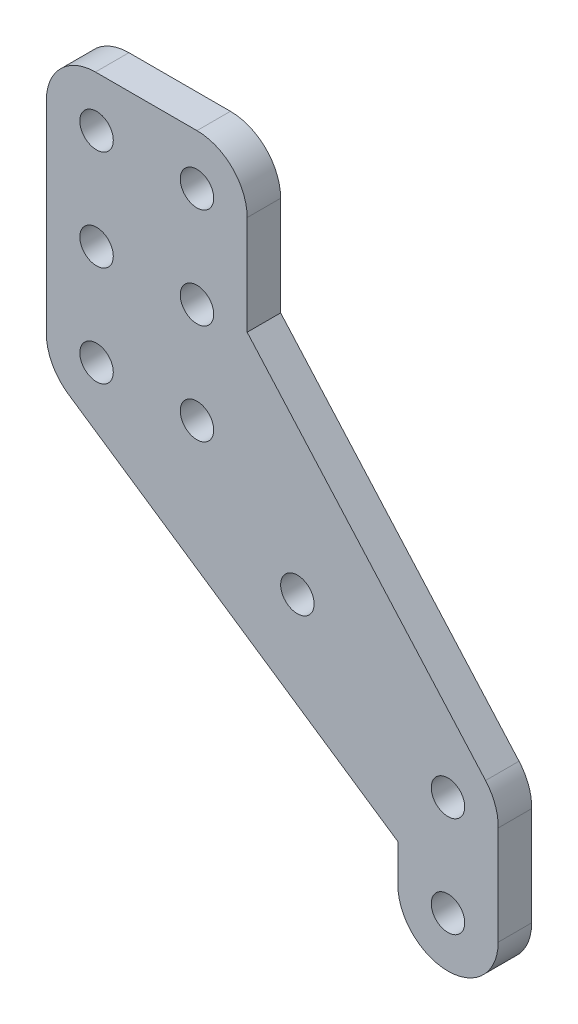
ISO-10303-21;
HEADER;
FILE_DESCRIPTION(('STEP AP214'),'2;1');
FILE_NAME('part.step','',(''),(''),'','','');
FILE_SCHEMA(('AUTOMOTIVE_DESIGN { 1 0 10303 214 1 1 1 1 }'));
ENDSEC;
DATA;
#1=APPLICATION_CONTEXT('core data for automotive mechanical design processes');
#2=APPLICATION_PROTOCOL_DEFINITION('international standard','automotive_design',2000,#1);
#3=PRODUCT_CONTEXT('',#1,'mechanical');
#4=PRODUCT('Part','Part','',(#3));
#5=PRODUCT_RELATED_PRODUCT_CATEGORY('part','',(#4));
#6=PRODUCT_DEFINITION_FORMATION('','',#4);
#7=PRODUCT_DEFINITION_CONTEXT('part definition',#1,'design');
#8=PRODUCT_DEFINITION('design','',#6,#7);
#9=PRODUCT_DEFINITION_SHAPE('','',#8);
#10=(LENGTH_UNIT() NAMED_UNIT(*) SI_UNIT(.MILLI.,.METRE.));
#11=(NAMED_UNIT(*) PLANE_ANGLE_UNIT() SI_UNIT($,.RADIAN.));
#12=(NAMED_UNIT(*) SI_UNIT($,.STERADIAN.) SOLID_ANGLE_UNIT());
#13=UNCERTAINTY_MEASURE_WITH_UNIT(LENGTH_MEASURE(1.E-05),#10,'distance_accuracy_value','');
#14=(GEOMETRIC_REPRESENTATION_CONTEXT(3) GLOBAL_UNCERTAINTY_ASSIGNED_CONTEXT((#13)) GLOBAL_UNIT_ASSIGNED_CONTEXT((#10,
#11,#12)) REPRESENTATION_CONTEXT('',''));
#15=CARTESIAN_POINT('',(0.,0.,0.));
#16=DIRECTION('',(0.,0.,1.));
#17=DIRECTION('',(1.,0.,0.));
#18=AXIS2_PLACEMENT_3D('',#15,#16,#17);
#19=CARTESIAN_POINT('',(79.4565649359122,0.,3.));
#20=DIRECTION('',(-1.,0.,0.));
#21=DIRECTION('',(0.,0.,1.));
#22=AXIS2_PLACEMENT_3D('',#19,#20,#21);
#23=PLANE('',#22);
#24=DIRECTION('',(0.,1.,0.));
#25=VECTOR('',#24,1.);
#26=CARTESIAN_POINT('',(79.4565649359122,0.,0.));
#27=LINE('',#26,#25);
#28=CARTESIAN_POINT('',(79.4565649359122,249.316156902,0.));
#29=VERTEX_POINT('',#28);
#30=CARTESIAN_POINT('',(79.4565649359122,252.639142715618,0.));
#31=VERTEX_POINT('',#30);
#32=EDGE_CURVE('E186',#29,#31,#27,.T.);
#33=ORIENTED_EDGE('',*,*,#32,.F.);
#34=DIRECTION('',(0.,0.,-1.));
#35=VECTOR('',#34,1.);
#36=CARTESIAN_POINT('',(79.4565649359122,249.316156902,3.));
#37=LINE('',#36,#35);
#38=CARTESIAN_POINT('',(79.4565649359122,249.316156902,3.));
#39=VERTEX_POINT('',#38);
#40=EDGE_CURVE('E12',#39,#29,#37,.T.);
#41=ORIENTED_EDGE('',*,*,#40,.F.);
#42=DIRECTION('',(0.,1.,0.));
#43=VECTOR('',#42,1.);
#44=CARTESIAN_POINT('',(79.4565649359122,0.,3.));
#45=LINE('',#44,#43);
#46=CARTESIAN_POINT('',(79.4565649359122,252.639142715618,3.));
#47=VERTEX_POINT('',#46);
#48=EDGE_CURVE('E254',#39,#47,#45,.T.);
#49=ORIENTED_EDGE('',*,*,#48,.T.);
#50=DIRECTION('',(0.,0.,-1.));
#51=VECTOR('',#50,1.);
#52=CARTESIAN_POINT('',(79.4565649359122,252.639142715618,3.));
#53=LINE('',#52,#51);
#54=EDGE_CURVE('E100',#47,#31,#53,.T.);
#55=ORIENTED_EDGE('',*,*,#54,.T.);
#56=EDGE_LOOP('',(#33,#41,#49,#55));
#57=FACE_BOUND('',#56,.T.);
#58=ADVANCED_FACE('F36',(#57),#23,.T.);
#59=CARTESIAN_POINT('',(83.9565649359122,249.316156902,3.));
#60=DIRECTION('',(0.,0.,-1.));
#61=DIRECTION('',(-1.,0.,0.));
#62=AXIS2_PLACEMENT_3D('',#59,#60,#61);
#63=CYLINDRICAL_SURFACE('',#62,4.5);
#64=CARTESIAN_POINT('',(83.9565649359122,249.316156902,0.));
#65=DIRECTION('',(0.,0.,1.));
#66=DIRECTION('',(1.,0.,0.));
#67=AXIS2_PLACEMENT_3D('',#64,#65,#66);
#68=CIRCLE('',#67,4.5);
#69=CARTESIAN_POINT('',(88.4565649359,249.316156902,0.));
#70=VERTEX_POINT('',#69);
#71=EDGE_CURVE('E188',#29,#70,#68,.T.);
#72=ORIENTED_EDGE('',*,*,#71,.T.);
#73=DIRECTION('',(0.,0.,-1.));
#74=VECTOR('',#73,1.);
#75=CARTESIAN_POINT('',(88.4565649359,249.316156902,3.));
#76=LINE('',#75,#74);
#77=CARTESIAN_POINT('',(88.4565649359,249.316156902,3.));
#78=VERTEX_POINT('',#77);
#79=EDGE_CURVE('E45',#78,#70,#76,.T.);
#80=ORIENTED_EDGE('',*,*,#79,.F.);
#81=CARTESIAN_POINT('',(83.9565649359122,249.316156902,3.));
#82=DIRECTION('',(0.,0.,1.));
#83=DIRECTION('',(1.,0.,0.));
#84=AXIS2_PLACEMENT_3D('',#81,#82,#83);
#85=CIRCLE('',#84,4.5);
#86=EDGE_CURVE('E252',#39,#78,#85,.T.);
#87=ORIENTED_EDGE('',*,*,#86,.F.);
#88=ORIENTED_EDGE('',*,*,#40,.T.);
#89=EDGE_LOOP('',(#72,#80,#87,#88));
#90=FACE_BOUND('',#89,.T.);
#91=ADVANCED_FACE('F241',(#90),#63,.T.);
#92=CARTESIAN_POINT('',(88.5141496779934,0.0204458570885828,3.));
#93=DIRECTION('',(0.99999997332188,0.000230989696195534,0.));
#94=DIRECTION('',(-0.000230989696195534,0.99999997332188,0.));
#95=AXIS2_PLACEMENT_3D('',#92,#93,#94);
#96=PLANE('',#95);
#97=DIRECTION('',(0.000230989696195534,-0.99999997332188,0.));
#98=VECTOR('',#97,1.);
#99=CARTESIAN_POINT('',(88.5141496779934,0.0204458570885828,0.));
#100=LINE('',#99,#98);
#101=CARTESIAN_POINT('',(88.4545173818,258.1804226208,0.));
#102=VERTEX_POINT('',#101);
#103=EDGE_CURVE('E191',#102,#70,#100,.T.);
#104=ORIENTED_EDGE('',*,*,#103,.F.);
#105=DIRECTION('',(0.,0.,-1.));
#106=VECTOR('',#105,1.);
#107=CARTESIAN_POINT('',(88.4545173818,258.1804226208,3.));
#108=LINE('',#107,#106);
#109=CARTESIAN_POINT('',(88.4545173818,258.1804226208,3.));
#110=VERTEX_POINT('',#109);
#111=EDGE_CURVE('E231',#110,#102,#108,.T.);
#112=ORIENTED_EDGE('',*,*,#111,.F.);
#113=DIRECTION('',(0.000230989696195534,-0.99999997332188,0.));
#114=VECTOR('',#113,1.);
#115=CARTESIAN_POINT('',(88.5141496779934,0.0204458570885828,3.));
#116=LINE('',#115,#114);
#117=EDGE_CURVE('E238',#110,#78,#116,.T.);
#118=ORIENTED_EDGE('',*,*,#117,.T.);
#119=ORIENTED_EDGE('',*,*,#79,.T.);
#120=EDGE_LOOP('',(#104,#112,#118,#119));
#121=FACE_BOUND('',#120,.T.);
#122=ADVANCED_FACE('F236',(#121),#96,.T.);
#123=CARTESIAN_POINT('',(83.9565649359758,258.316156902041,3.));
#124=DIRECTION('',(0.,0.,-1.));
#125=DIRECTION('',(-1.,0.,0.));
#126=AXIS2_PLACEMENT_3D('',#123,#124,#125);
#127=CYLINDRICAL_SURFACE('',#126,4.50000000000001);
#128=CARTESIAN_POINT('',(83.9565649359758,258.316156902041,0.));
#129=DIRECTION('',(0.,0.,1.));
#130=DIRECTION('',(1.,0.,0.));
#131=AXIS2_PLACEMENT_3D('',#128,#129,#130);
#132=CIRCLE('',#131,4.50000000000001);
#133=CARTESIAN_POINT('',(87.3246253296,261.3004774587,0.));
#134=VERTEX_POINT('',#133);
#135=EDGE_CURVE('E194',#102,#134,#132,.T.);
#136=ORIENTED_EDGE('',*,*,#135,.T.);
#137=DIRECTION('',(0.,0.,-1.));
#138=VECTOR('',#137,1.);
#139=CARTESIAN_POINT('',(87.3246253296,261.3004774587,3.));
#140=LINE('',#139,#138);
#141=CARTESIAN_POINT('',(87.3246253296,261.3004774587,3.));
#142=VERTEX_POINT('',#141);
#143=EDGE_CURVE('E228',#142,#134,#140,.T.);
#144=ORIENTED_EDGE('',*,*,#143,.F.);
#145=CARTESIAN_POINT('',(83.9565649359758,258.316156902041,3.));
#146=DIRECTION('',(0.,0.,1.));
#147=DIRECTION('',(1.,0.,0.));
#148=AXIS2_PLACEMENT_3D('',#145,#146,#147);
#149=CIRCLE('',#148,4.50000000000001);
#150=EDGE_CURVE('E249',#110,#142,#149,.T.);
#151=ORIENTED_EDGE('',*,*,#150,.F.);
#152=ORIENTED_EDGE('',*,*,#111,.T.);
#153=EDGE_LOOP('',(#136,#144,#151,#152));
#154=FACE_BOUND('',#153,.T.);
#155=ADVANCED_FACE('F246',(#154),#127,.T.);
#156=CARTESIAN_POINT('',(178.61847131618,158.267582362266,3.));
#157=DIRECTION('',(-0.748457865249174,-0.663182345925047,0.));
#158=DIRECTION('',(0.663182345925047,-0.748457865249174,0.));
#159=AXIS2_PLACEMENT_3D('',#156,#157,#158);
#160=PLANE('',#159);
#161=DIRECTION('',(-0.663182345925047,0.748457865249174,0.));
#162=VECTOR('',#161,1.);
#163=CARTESIAN_POINT('',(178.61847131618,158.267582362266,0.));
#164=LINE('',#163,#162);
#165=CARTESIAN_POINT('',(65.9565649359,285.416156902,0.));
#166=VERTEX_POINT('',#165);
#167=EDGE_CURVE('E197',#134,#166,#164,.T.);
#168=ORIENTED_EDGE('',*,*,#167,.T.);
#169=DIRECTION('',(0.,0.,-1.));
#170=VECTOR('',#169,1.);
#171=CARTESIAN_POINT('',(65.9565649359,285.416156902,3.));
#172=LINE('',#171,#170);
#173=CARTESIAN_POINT('',(65.9565649359,285.416156902,3.));
#174=VERTEX_POINT('',#173);
#175=EDGE_CURVE('E226',#174,#166,#172,.T.);
#176=ORIENTED_EDGE('',*,*,#175,.F.);
#177=DIRECTION('',(-0.663182345925047,0.748457865249174,0.));
#178=VECTOR('',#177,1.);
#179=CARTESIAN_POINT('',(178.61847131618,158.267582362266,3.));
#180=LINE('',#179,#178);
#181=EDGE_CURVE('E250',#142,#174,#180,.T.);
#182=ORIENTED_EDGE('',*,*,#181,.F.);
#183=ORIENTED_EDGE('',*,*,#143,.T.);
#184=EDGE_LOOP('',(#168,#176,#182,#183));
#185=FACE_BOUND('',#184,.T.);
#186=ADVANCED_FACE('F474',(#185),#160,.F.);
#187=CARTESIAN_POINT('',(65.9565649359,0.,3.));
#188=DIRECTION('',(1.,0.,0.));
#189=DIRECTION('',(0.,0.,-1.));
#190=AXIS2_PLACEMENT_3D('',#187,#188,#189);
#191=PLANE('',#190);
#192=DIRECTION('',(0.,-1.,0.));
#193=VECTOR('',#192,1.);
#194=CARTESIAN_POINT('',(65.9565649359,0.,0.));
#195=LINE('',#194,#193);
#196=CARTESIAN_POINT('',(65.9565649359,294.316156902,0.));
#197=VERTEX_POINT('',#196);
#198=EDGE_CURVE('E200',#197,#166,#195,.T.);
#199=ORIENTED_EDGE('',*,*,#198,.F.);
#200=DIRECTION('',(0.,0.,-1.));
#201=VECTOR('',#200,1.);
#202=CARTESIAN_POINT('',(65.9565649359,294.316156902,3.));
#203=LINE('',#202,#201);
#204=CARTESIAN_POINT('',(65.9565649359,294.316156902,3.));
#205=VERTEX_POINT('',#204);
#206=EDGE_CURVE('E224',#205,#197,#203,.T.);
#207=ORIENTED_EDGE('',*,*,#206,.F.);
#208=DIRECTION('',(0.,-1.,0.));
#209=VECTOR('',#208,1.);
#210=CARTESIAN_POINT('',(65.9565649359,0.,3.));
#211=LINE('',#210,#209);
#212=EDGE_CURVE('E259',#205,#174,#211,.T.);
#213=ORIENTED_EDGE('',*,*,#212,.T.);
#214=ORIENTED_EDGE('',*,*,#175,.T.);
#215=EDGE_LOOP('',(#199,#207,#213,#214));
#216=FACE_BOUND('',#215,.T.);
#217=ADVANCED_FACE('F466',(#216),#191,.T.);
#218=CARTESIAN_POINT('',(61.4565649359,294.316156902,3.));
#219=DIRECTION('',(0.,0.,-1.));
#220=DIRECTION('',(-1.,0.,0.));
#221=AXIS2_PLACEMENT_3D('',#218,#219,#220);
#222=CYLINDRICAL_SURFACE('',#221,4.5);
#223=CARTESIAN_POINT('',(61.4565649359,294.316156902,0.));
#224=DIRECTION('',(0.,0.,1.));
#225=DIRECTION('',(1.,0.,0.));
#226=AXIS2_PLACEMENT_3D('',#223,#224,#225);
#227=CIRCLE('',#226,4.5);
#228=CARTESIAN_POINT('',(61.4565649359,298.816156902,0.));
#229=VERTEX_POINT('',#228);
#230=EDGE_CURVE('E203',#197,#229,#227,.T.);
#231=ORIENTED_EDGE('',*,*,#230,.T.);
#232=DIRECTION('',(0.,0.,-1.));
#233=VECTOR('',#232,1.);
#234=CARTESIAN_POINT('',(61.4565649359,298.816156902,3.));
#235=LINE('',#234,#233);
#236=CARTESIAN_POINT('',(61.4565649359,298.816156902,3.));
#237=VERTEX_POINT('',#236);
#238=EDGE_CURVE('E222',#237,#229,#235,.T.);
#239=ORIENTED_EDGE('',*,*,#238,.F.);
#240=CARTESIAN_POINT('',(61.4565649359,294.316156902,3.));
#241=DIRECTION('',(0.,0.,1.));
#242=DIRECTION('',(1.,0.,0.));
#243=AXIS2_PLACEMENT_3D('',#240,#241,#242);
#244=CIRCLE('',#243,4.5);
#245=EDGE_CURVE('E262',#205,#237,#244,.T.);
#246=ORIENTED_EDGE('',*,*,#245,.F.);
#247=ORIENTED_EDGE('',*,*,#206,.T.);
#248=EDGE_LOOP('',(#231,#239,#246,#247));
#249=FACE_BOUND('',#248,.T.);
#250=ADVANCED_FACE('F271',(#249),#222,.T.);
#251=CARTESIAN_POINT('',(0.,298.816156902,3.));
#252=DIRECTION('',(0.,1.,0.));
#253=DIRECTION('',(0.,0.,1.));
#254=AXIS2_PLACEMENT_3D('',#251,#252,#253);
#255=PLANE('',#254);
#256=DIRECTION('',(1.,0.,0.));
#257=VECTOR('',#256,1.);
#258=CARTESIAN_POINT('',(0.,298.816156902,0.));
#259=LINE('',#258,#257);
#260=CARTESIAN_POINT('',(52.3565649359,298.816156902,0.));
#261=VERTEX_POINT('',#260);
#262=EDGE_CURVE('E206',#261,#229,#259,.T.);
#263=ORIENTED_EDGE('',*,*,#262,.F.);
#264=DIRECTION('',(0.,0.,-1.));
#265=VECTOR('',#264,1.);
#266=CARTESIAN_POINT('',(52.3565649359,298.816156902,3.));
#267=LINE('',#266,#265);
#268=CARTESIAN_POINT('',(52.3565649359,298.816156902,3.));
#269=VERTEX_POINT('',#268);
#270=EDGE_CURVE('E220',#269,#261,#267,.T.);
#271=ORIENTED_EDGE('',*,*,#270,.F.);
#272=DIRECTION('',(1.,0.,0.));
#273=VECTOR('',#272,1.);
#274=CARTESIAN_POINT('',(0.,298.816156902,3.));
#275=LINE('',#274,#273);
#276=EDGE_CURVE('E154',#269,#237,#275,.T.);
#277=ORIENTED_EDGE('',*,*,#276,.T.);
#278=ORIENTED_EDGE('',*,*,#238,.T.);
#279=EDGE_LOOP('',(#263,#271,#277,#278));
#280=FACE_BOUND('',#279,.T.);
#281=ADVANCED_FACE('F266',(#280),#255,.T.);
#282=CARTESIAN_POINT('',(52.3565649359001,294.416156902,3.));
#283=DIRECTION('',(0.,0.,-1.));
#284=DIRECTION('',(-1.,0.,0.));
#285=AXIS2_PLACEMENT_3D('',#282,#283,#284);
#286=CYLINDRICAL_SURFACE('',#285,4.40000000000007);
#287=CARTESIAN_POINT('',(52.3565649359001,294.416156902,0.));
#288=DIRECTION('',(0.,0.,1.));
#289=DIRECTION('',(1.,0.,0.));
#290=AXIS2_PLACEMENT_3D('',#287,#288,#289);
#291=CIRCLE('',#290,4.40000000000007);
#292=CARTESIAN_POINT('',(47.9565649359,294.416156902,0.));
#293=VERTEX_POINT('',#292);
#294=EDGE_CURVE('E209',#261,#293,#291,.T.);
#295=ORIENTED_EDGE('',*,*,#294,.T.);
#296=DIRECTION('',(0.,0.,-1.));
#297=VECTOR('',#296,1.);
#298=CARTESIAN_POINT('',(47.9565649359,294.416156902,3.));
#299=LINE('',#298,#297);
#300=CARTESIAN_POINT('',(47.9565649359,294.416156902,3.));
#301=VERTEX_POINT('',#300);
#302=EDGE_CURVE('E141',#301,#293,#299,.T.);
#303=ORIENTED_EDGE('',*,*,#302,.F.);
#304=CARTESIAN_POINT('',(52.3565649359001,294.416156902,3.));
#305=DIRECTION('',(0.,0.,1.));
#306=DIRECTION('',(1.,0.,0.));
#307=AXIS2_PLACEMENT_3D('',#304,#305,#306);
#308=CIRCLE('',#307,4.40000000000007);
#309=EDGE_CURVE('E151',#269,#301,#308,.T.);
#310=ORIENTED_EDGE('',*,*,#309,.F.);
#311=ORIENTED_EDGE('',*,*,#270,.T.);
#312=EDGE_LOOP('',(#295,#303,#310,#311));
#313=FACE_BOUND('',#312,.T.);
#314=ADVANCED_FACE('F276',(#313),#286,.T.);
#315=CARTESIAN_POINT('',(47.9565649359,0.,3.));
#316=DIRECTION('',(-1.,0.,0.));
#317=DIRECTION('',(0.,0.,1.));
#318=AXIS2_PLACEMENT_3D('',#315,#316,#317);
#319=PLANE('',#318);
#320=DIRECTION('',(0.,1.,0.));
#321=VECTOR('',#320,1.);
#322=CARTESIAN_POINT('',(47.9565649359,0.,0.));
#323=LINE('',#322,#321);
#324=CARTESIAN_POINT('',(47.9565649359,276.316156902,0.));
#325=VERTEX_POINT('',#324);
#326=EDGE_CURVE('E138',#325,#293,#323,.T.);
#327=ORIENTED_EDGE('',*,*,#326,.F.);
#328=DIRECTION('',(0.,0.,-1.));
#329=VECTOR('',#328,1.);
#330=CARTESIAN_POINT('',(47.9565649359,276.316156902,3.));
#331=LINE('',#330,#329);
#332=CARTESIAN_POINT('',(47.9565649359,276.316156902,3.));
#333=VERTEX_POINT('',#332);
#334=EDGE_CURVE('E132',#333,#325,#331,.T.);
#335=ORIENTED_EDGE('',*,*,#334,.F.);
#336=DIRECTION('',(0.,1.,0.));
#337=VECTOR('',#336,1.);
#338=CARTESIAN_POINT('',(47.9565649359,0.,3.));
#339=LINE('',#338,#337);
#340=EDGE_CURVE('E136',#333,#301,#339,.T.);
#341=ORIENTED_EDGE('',*,*,#340,.T.);
#342=ORIENTED_EDGE('',*,*,#302,.T.);
#343=EDGE_LOOP('',(#327,#335,#341,#342));
#344=FACE_BOUND('',#343,.T.);
#345=ADVANCED_FACE('F134',(#344),#319,.T.);
#346=CARTESIAN_POINT('',(52.456564935914,276.316156902,3.));
#347=DIRECTION('',(0.,0.,-1.));
#348=DIRECTION('',(-1.,0.,0.));
#349=AXIS2_PLACEMENT_3D('',#346,#347,#348);
#350=CYLINDRICAL_SURFACE('',#349,4.500000000014);
#351=CARTESIAN_POINT('',(52.456564935914,276.316156902,0.));
#352=DIRECTION('',(0.,0.,1.));
#353=DIRECTION('',(1.,0.,0.));
#354=AXIS2_PLACEMENT_3D('',#351,#352,#353);
#355=CIRCLE('',#354,4.500000000014);
#356=CARTESIAN_POINT('',(49.9369593248122,272.587673622618,0.));
#357=VERTEX_POINT('',#356);
#358=EDGE_CURVE('E213',#325,#357,#355,.T.);
#359=ORIENTED_EDGE('',*,*,#358,.T.);
#360=DIRECTION('',(0.,0.,-1.));
#361=VECTOR('',#360,1.);
#362=CARTESIAN_POINT('',(49.9369593248122,272.587673622618,3.));
#363=LINE('',#362,#361);
#364=CARTESIAN_POINT('',(49.9369593248122,272.587673622618,3.));
#365=VERTEX_POINT('',#364);
#366=EDGE_CURVE('E142',#365,#357,#363,.T.);
#367=ORIENTED_EDGE('',*,*,#366,.F.);
#368=CARTESIAN_POINT('',(52.456564935914,276.316156902,3.));
#369=DIRECTION('',(0.,0.,1.));
#370=DIRECTION('',(1.,0.,0.));
#371=AXIS2_PLACEMENT_3D('',#368,#369,#370);
#372=CIRCLE('',#371,4.500000000014);
#373=EDGE_CURVE('E145',#333,#365,#372,.T.);
#374=ORIENTED_EDGE('',*,*,#373,.F.);
#375=ORIENTED_EDGE('',*,*,#334,.T.);
#376=EDGE_LOOP('',(#359,#367,#374,#375));
#377=FACE_BOUND('',#376,.T.);
#378=ADVANCED_FACE('F146',(#377),#350,.T.);
#379=CARTESIAN_POINT('',(70.4565649359,267.316156902,3.));
#380=DIRECTION('',(0.,0.,-1.));
#381=DIRECTION('',(-1.,0.,0.));
#382=AXIS2_PLACEMENT_3D('',#379,#380,#381);
#383=CYLINDRICAL_SURFACE('',#382,1.5);
#384=CARTESIAN_POINT('',(70.4565649359,267.316156902,3.));
#385=DIRECTION('',(0.,0.,1.));
#386=DIRECTION('',(1.,0.,0.));
#387=AXIS2_PLACEMENT_3D('',#384,#385,#386);
#388=CIRCLE('',#387,1.5);
#389=CARTESIAN_POINT('',(71.9565649359,267.316156902,3.));
#390=VERTEX_POINT('',#389);
#391=EDGE_CURVE('E518',#390,#390,#388,.T.);
#392=ORIENTED_EDGE('',*,*,#391,.T.);
#393=EDGE_LOOP('',(#392));
#394=FACE_BOUND('',#393,.T.);
#395=CARTESIAN_POINT('',(70.4565649359,267.316156902,0.));
#396=DIRECTION('',(0.,0.,1.));
#397=DIRECTION('',(1.,0.,0.));
#398=AXIS2_PLACEMENT_3D('',#395,#396,#397);
#399=CIRCLE('',#398,1.5);
#400=CARTESIAN_POINT('',(71.9565649359,267.316156902,0.));
#401=VERTEX_POINT('',#400);
#402=EDGE_CURVE('E183',#401,#401,#399,.T.);
#403=ORIENTED_EDGE('',*,*,#402,.F.);
#404=EDGE_LOOP('',(#403));
#405=FACE_BOUND('',#404,.T.);
#406=ADVANCED_FACE('F293',(#394,#405),#383,.F.);
#407=CARTESIAN_POINT('',(83.9565649359758,258.316156902041,3.));
#408=DIRECTION('',(0.,0.,-1.));
#409=DIRECTION('',(-1.,0.,0.));
#410=AXIS2_PLACEMENT_3D('',#407,#408,#409);
#411=CYLINDRICAL_SURFACE('',#410,1.49999999992423);
#412=CARTESIAN_POINT('',(83.9565649359758,258.316156902041,3.));
#413=DIRECTION('',(0.,0.,1.));
#414=DIRECTION('',(1.,0.,0.));
#415=AXIS2_PLACEMENT_3D('',#412,#413,#414);
#416=CIRCLE('',#415,1.49999999992423);
#417=CARTESIAN_POINT('',(85.4565649359,258.316156902041,3.));
#418=VERTEX_POINT('',#417);
#419=EDGE_CURVE('E520',#418,#418,#416,.T.);
#420=ORIENTED_EDGE('',*,*,#419,.T.);
#421=EDGE_LOOP('',(#420));
#422=FACE_BOUND('',#421,.T.);
#423=CARTESIAN_POINT('',(83.9565649359758,258.316156902041,0.));
#424=DIRECTION('',(0.,0.,1.));
#425=DIRECTION('',(1.,0.,0.));
#426=AXIS2_PLACEMENT_3D('',#423,#424,#425);
#427=CIRCLE('',#426,1.49999999992423);
#428=CARTESIAN_POINT('',(85.4565649359,258.316156902041,0.));
#429=VERTEX_POINT('',#428);
#430=EDGE_CURVE('E180',#429,#429,#427,.T.);
#431=ORIENTED_EDGE('',*,*,#430,.F.);
#432=EDGE_LOOP('',(#431));
#433=FACE_BOUND('',#432,.T.);
#434=ADVANCED_FACE('F296',(#422,#433),#411,.F.);
#435=CARTESIAN_POINT('',(61.4565649359,276.316156902,3.));
#436=DIRECTION('',(0.,0.,-1.));
#437=DIRECTION('',(-1.,0.,0.));
#438=AXIS2_PLACEMENT_3D('',#435,#436,#437);
#439=CYLINDRICAL_SURFACE('',#438,1.5);
#440=CARTESIAN_POINT('',(61.4565649359,276.316156902,3.));
#441=DIRECTION('',(0.,0.,1.));
#442=DIRECTION('',(1.,0.,0.));
#443=AXIS2_PLACEMENT_3D('',#440,#441,#442);
#444=CIRCLE('',#443,1.5);
#445=CARTESIAN_POINT('',(62.9565649359,276.316156902,3.));
#446=VERTEX_POINT('',#445);
#447=EDGE_CURVE('E525',#446,#446,#444,.T.);
#448=ORIENTED_EDGE('',*,*,#447,.T.);
#449=EDGE_LOOP('',(#448));
#450=FACE_BOUND('',#449,.T.);
#451=CARTESIAN_POINT('',(61.4565649359,276.316156902,0.));
#452=DIRECTION('',(0.,0.,1.));
#453=DIRECTION('',(1.,0.,0.));
#454=AXIS2_PLACEMENT_3D('',#451,#452,#453);
#455=CIRCLE('',#454,1.5);
#456=CARTESIAN_POINT('',(62.9565649359,276.316156902,0.));
#457=VERTEX_POINT('',#456);
#458=EDGE_CURVE('E177',#457,#457,#455,.T.);
#459=ORIENTED_EDGE('',*,*,#458,.F.);
#460=EDGE_LOOP('',(#459));
#461=FACE_BOUND('',#460,.T.);
#462=ADVANCED_FACE('F300',(#450,#461),#439,.F.);
#463=CARTESIAN_POINT('',(61.4565649359,285.316156902,3.));
#464=DIRECTION('',(0.,0.,-1.));
#465=DIRECTION('',(-1.,0.,0.));
#466=AXIS2_PLACEMENT_3D('',#463,#464,#465);
#467=CYLINDRICAL_SURFACE('',#466,1.5);
#468=CARTESIAN_POINT('',(61.4565649359,285.316156902,3.));
#469=DIRECTION('',(0.,0.,1.));
#470=DIRECTION('',(1.,0.,0.));
#471=AXIS2_PLACEMENT_3D('',#468,#469,#470);
#472=CIRCLE('',#471,1.5);
#473=CARTESIAN_POINT('',(62.9565649359,285.316156902,3.));
#474=VERTEX_POINT('',#473);
#475=EDGE_CURVE('E528',#474,#474,#472,.T.);
#476=ORIENTED_EDGE('',*,*,#475,.T.);
#477=EDGE_LOOP('',(#476));
#478=FACE_BOUND('',#477,.T.);
#479=CARTESIAN_POINT('',(61.4565649359,285.316156902,0.));
#480=DIRECTION('',(0.,0.,1.));
#481=DIRECTION('',(1.,0.,0.));
#482=AXIS2_PLACEMENT_3D('',#479,#480,#481);
#483=CIRCLE('',#482,1.5);
#484=CARTESIAN_POINT('',(62.9565649359,285.316156902,0.));
#485=VERTEX_POINT('',#484);
#486=EDGE_CURVE('E174',#485,#485,#483,.T.);
#487=ORIENTED_EDGE('',*,*,#486,.F.);
#488=EDGE_LOOP('',(#487));
#489=FACE_BOUND('',#488,.T.);
#490=ADVANCED_FACE('F304',(#478,#489),#467,.F.);
#491=CARTESIAN_POINT('',(61.4565649359,294.316156902,3.));
#492=DIRECTION('',(0.,0.,-1.));
#493=DIRECTION('',(-1.,0.,0.));
#494=AXIS2_PLACEMENT_3D('',#491,#492,#493);
#495=CYLINDRICAL_SURFACE('',#494,1.5);
#496=CARTESIAN_POINT('',(61.4565649359,294.316156902,3.));
#497=DIRECTION('',(0.,0.,1.));
#498=DIRECTION('',(1.,0.,0.));
#499=AXIS2_PLACEMENT_3D('',#496,#497,#498);
#500=CIRCLE('',#499,1.5);
#501=CARTESIAN_POINT('',(62.9565649359,294.316156902,3.));
#502=VERTEX_POINT('',#501);
#503=EDGE_CURVE('E531',#502,#502,#500,.T.);
#504=ORIENTED_EDGE('',*,*,#503,.T.);
#505=EDGE_LOOP('',(#504));
#506=FACE_BOUND('',#505,.T.);
#507=CARTESIAN_POINT('',(61.4565649359,294.316156902,0.));
#508=DIRECTION('',(0.,0.,1.));
#509=DIRECTION('',(1.,0.,0.));
#510=AXIS2_PLACEMENT_3D('',#507,#508,#509);
#511=CIRCLE('',#510,1.5);
#512=CARTESIAN_POINT('',(62.9565649359,294.316156902,0.));
#513=VERTEX_POINT('',#512);
#514=EDGE_CURVE('E171',#513,#513,#511,.T.);
#515=ORIENTED_EDGE('',*,*,#514,.F.);
#516=EDGE_LOOP('',(#515));
#517=FACE_BOUND('',#516,.T.);
#518=ADVANCED_FACE('F308',(#506,#517),#495,.F.);
#519=CARTESIAN_POINT('',(83.9565649359122,249.316156902,3.));
#520=DIRECTION('',(0.,0.,-1.));
#521=DIRECTION('',(-1.,0.,0.));
#522=AXIS2_PLACEMENT_3D('',#519,#520,#521);
#523=CYLINDRICAL_SURFACE('',#522,1.49999999998779);
#524=CARTESIAN_POINT('',(83.9565649359122,249.316156902,3.));
#525=DIRECTION('',(0.,0.,1.));
#526=DIRECTION('',(1.,0.,0.));
#527=AXIS2_PLACEMENT_3D('',#524,#525,#526);
#528=CIRCLE('',#527,1.49999999998779);
#529=CARTESIAN_POINT('',(85.4565649359,249.316156902,3.));
#530=VERTEX_POINT('',#529);
#531=EDGE_CURVE('E534',#530,#530,#528,.T.);
#532=ORIENTED_EDGE('',*,*,#531,.T.);
#533=EDGE_LOOP('',(#532));
#534=FACE_BOUND('',#533,.T.);
#535=CARTESIAN_POINT('',(83.9565649359122,249.316156902,0.));
#536=DIRECTION('',(0.,0.,1.));
#537=DIRECTION('',(1.,0.,0.));
#538=AXIS2_PLACEMENT_3D('',#535,#536,#537);
#539=CIRCLE('',#538,1.49999999998779);
#540=CARTESIAN_POINT('',(85.4565649359,249.316156902,0.));
#541=VERTEX_POINT('',#540);
#542=EDGE_CURVE('E168',#541,#541,#539,.T.);
#543=ORIENTED_EDGE('',*,*,#542,.F.);
#544=EDGE_LOOP('',(#543));
#545=FACE_BOUND('',#544,.T.);
#546=ADVANCED_FACE('F312',(#534,#545),#523,.F.);
#547=CARTESIAN_POINT('',(52.4565649359,294.316156902,3.));
#548=DIRECTION('',(0.,0.,-1.));
#549=DIRECTION('',(-1.,0.,0.));
#550=AXIS2_PLACEMENT_3D('',#547,#548,#549);
#551=CYLINDRICAL_SURFACE('',#550,1.5);
#552=CARTESIAN_POINT('',(52.4565649359,294.316156902,3.));
#553=DIRECTION('',(0.,0.,1.));
#554=DIRECTION('',(1.,0.,0.));
#555=AXIS2_PLACEMENT_3D('',#552,#553,#554);
#556=CIRCLE('',#555,1.5);
#557=CARTESIAN_POINT('',(53.9565649359,294.316156902,3.));
#558=VERTEX_POINT('',#557);
#559=EDGE_CURVE('E537',#558,#558,#556,.T.);
#560=ORIENTED_EDGE('',*,*,#559,.T.);
#561=EDGE_LOOP('',(#560));
#562=FACE_BOUND('',#561,.T.);
#563=CARTESIAN_POINT('',(52.4565649359,294.316156902,0.));
#564=DIRECTION('',(0.,0.,1.));
#565=DIRECTION('',(1.,0.,0.));
#566=AXIS2_PLACEMENT_3D('',#563,#564,#565);
#567=CIRCLE('',#566,1.5);
#568=CARTESIAN_POINT('',(53.9565649359,294.316156902,0.));
#569=VERTEX_POINT('',#568);
#570=EDGE_CURVE('E165',#569,#569,#567,.T.);
#571=ORIENTED_EDGE('',*,*,#570,.F.);
#572=EDGE_LOOP('',(#571));
#573=FACE_BOUND('',#572,.T.);
#574=ADVANCED_FACE('F316',(#562,#573),#551,.F.);
#575=CARTESIAN_POINT('',(52.456564935914,276.316156902,3.));
#576=DIRECTION('',(0.,0.,-1.));
#577=DIRECTION('',(-1.,0.,0.));
#578=AXIS2_PLACEMENT_3D('',#575,#576,#577);
#579=CYLINDRICAL_SURFACE('',#578,1.499999999986);
#580=CARTESIAN_POINT('',(52.456564935914,276.316156902,3.));
#581=DIRECTION('',(0.,0.,1.));
#582=DIRECTION('',(1.,0.,0.));
#583=AXIS2_PLACEMENT_3D('',#580,#581,#582);
#584=CIRCLE('',#583,1.499999999986);
#585=CARTESIAN_POINT('',(53.9565649359,276.316156902,3.));
#586=VERTEX_POINT('',#585);
#587=EDGE_CURVE('E331',#586,#586,#584,.T.);
#588=ORIENTED_EDGE('',*,*,#587,.T.);
#589=EDGE_LOOP('',(#588));
#590=FACE_BOUND('',#589,.T.);
#591=CARTESIAN_POINT('',(52.456564935914,276.316156902,0.));
#592=DIRECTION('',(0.,0.,1.));
#593=DIRECTION('',(1.,0.,0.));
#594=AXIS2_PLACEMENT_3D('',#591,#592,#593);
#595=CIRCLE('',#594,1.499999999986);
#596=CARTESIAN_POINT('',(53.9565649359,276.316156902,0.));
#597=VERTEX_POINT('',#596);
#598=EDGE_CURVE('E162',#597,#597,#595,.T.);
#599=ORIENTED_EDGE('',*,*,#598,.F.);
#600=EDGE_LOOP('',(#599));
#601=FACE_BOUND('',#600,.T.);
#602=ADVANCED_FACE('F319',(#590,#601),#579,.F.);
#603=CARTESIAN_POINT('',(52.4565649359,285.316156902,3.));
#604=DIRECTION('',(0.,0.,-1.));
#605=DIRECTION('',(-1.,0.,0.));
#606=AXIS2_PLACEMENT_3D('',#603,#604,#605);
#607=CYLINDRICAL_SURFACE('',#606,1.5);
#608=CARTESIAN_POINT('',(52.4565649359,285.316156902,3.));
#609=DIRECTION('',(0.,0.,1.));
#610=DIRECTION('',(1.,0.,0.));
#611=AXIS2_PLACEMENT_3D('',#608,#609,#610);
#612=CIRCLE('',#611,1.5);
#613=CARTESIAN_POINT('',(53.9565649359,285.316156902,3.));
#614=VERTEX_POINT('',#613);
#615=EDGE_CURVE('E216',#614,#614,#612,.T.);
#616=ORIENTED_EDGE('',*,*,#615,.T.);
#617=EDGE_LOOP('',(#616));
#618=FACE_BOUND('',#617,.T.);
#619=CARTESIAN_POINT('',(52.4565649359,285.316156902,0.));
#620=DIRECTION('',(0.,0.,1.));
#621=DIRECTION('',(1.,0.,0.));
#622=AXIS2_PLACEMENT_3D('',#619,#620,#621);
#623=CIRCLE('',#622,1.5);
#624=CARTESIAN_POINT('',(53.9565649359,285.316156902,0.));
#625=VERTEX_POINT('',#624);
#626=EDGE_CURVE('E159',#625,#625,#623,.T.);
#627=ORIENTED_EDGE('',*,*,#626,.F.);
#628=EDGE_LOOP('',(#627));
#629=FACE_BOUND('',#628,.T.);
#630=ADVANCED_FACE('F38',(#618,#629),#607,.F.);
#631=CARTESIAN_POINT('',(142.113225220891,210.297509135306,3.));
#632=DIRECTION('',(0.559912358018758,0.828551839861498,0.));
#633=DIRECTION('',(-0.828551839861498,0.559912358018758,0.));
#634=AXIS2_PLACEMENT_3D('',#631,#632,#633);
#635=PLANE('',#634);
#636=DIRECTION('',(0.828551839861498,-0.559912358018758,0.));
#637=VECTOR('',#636,1.);
#638=CARTESIAN_POINT('',(142.113225220891,210.297509135306,0.));
#639=LINE('',#638,#637);
#640=EDGE_CURVE('E93',#357,#31,#639,.T.);
#641=ORIENTED_EDGE('',*,*,#640,.T.);
#642=ORIENTED_EDGE('',*,*,#54,.F.);
#643=DIRECTION('',(0.828551839861498,-0.559912358018758,0.));
#644=VECTOR('',#643,1.);
#645=CARTESIAN_POINT('',(142.113225220891,210.297509135306,3.));
#646=LINE('',#645,#644);
#647=EDGE_CURVE('E53',#365,#47,#646,.T.);
#648=ORIENTED_EDGE('',*,*,#647,.F.);
#649=ORIENTED_EDGE('',*,*,#366,.T.);
#650=EDGE_LOOP('',(#641,#642,#648,#649));
#651=FACE_BOUND('',#650,.T.);
#652=ADVANCED_FACE('F326',(#651),#635,.F.);
#653=CARTESIAN_POINT('',(0.,0.,3.));
#654=DIRECTION('',(0.,0.,1.));
#655=DIRECTION('',(1.,0.,0.));
#656=AXIS2_PLACEMENT_3D('',#653,#654,#655);
#657=PLANE('',#656);
#658=ORIENTED_EDGE('',*,*,#615,.F.);
#659=EDGE_LOOP('',(#658));
#660=FACE_BOUND('',#659,.T.);
#661=ORIENTED_EDGE('',*,*,#587,.F.);
#662=EDGE_LOOP('',(#661));
#663=FACE_BOUND('',#662,.T.);
#664=ORIENTED_EDGE('',*,*,#559,.F.);
#665=EDGE_LOOP('',(#664));
#666=FACE_BOUND('',#665,.T.);
#667=ORIENTED_EDGE('',*,*,#531,.F.);
#668=EDGE_LOOP('',(#667));
#669=FACE_BOUND('',#668,.T.);
#670=ORIENTED_EDGE('',*,*,#503,.F.);
#671=EDGE_LOOP('',(#670));
#672=FACE_BOUND('',#671,.T.);
#673=ORIENTED_EDGE('',*,*,#475,.F.);
#674=EDGE_LOOP('',(#673));
#675=FACE_BOUND('',#674,.T.);
#676=ORIENTED_EDGE('',*,*,#447,.F.);
#677=EDGE_LOOP('',(#676));
#678=FACE_BOUND('',#677,.T.);
#679=ORIENTED_EDGE('',*,*,#419,.F.);
#680=EDGE_LOOP('',(#679));
#681=FACE_BOUND('',#680,.T.);
#682=ORIENTED_EDGE('',*,*,#391,.F.);
#683=EDGE_LOOP('',(#682));
#684=FACE_BOUND('',#683,.T.);
#685=ORIENTED_EDGE('',*,*,#48,.F.);
#686=ORIENTED_EDGE('',*,*,#86,.T.);
#687=ORIENTED_EDGE('',*,*,#117,.F.);
#688=ORIENTED_EDGE('',*,*,#150,.T.);
#689=ORIENTED_EDGE('',*,*,#181,.T.);
#690=ORIENTED_EDGE('',*,*,#212,.F.);
#691=ORIENTED_EDGE('',*,*,#245,.T.);
#692=ORIENTED_EDGE('',*,*,#276,.F.);
#693=ORIENTED_EDGE('',*,*,#309,.T.);
#694=ORIENTED_EDGE('',*,*,#340,.F.);
#695=ORIENTED_EDGE('',*,*,#373,.T.);
#696=ORIENTED_EDGE('',*,*,#647,.T.);
#697=EDGE_LOOP('',(#685,#686,#687,#688,#689,#690,#691,#692,#693,#694,#695,#696));
#698=FACE_BOUND('',#697,.T.);
#699=ADVANCED_FACE('F148',(#660,#663,#666,#669,#672,#675,#678,#681,#684,#698),#657,.T.);
#700=CARTESIAN_POINT('',(0.,0.,0.));
#701=DIRECTION('',(0.,0.,1.));
#702=DIRECTION('',(1.,0.,0.));
#703=AXIS2_PLACEMENT_3D('',#700,#701,#702);
#704=PLANE('',#703);
#705=ORIENTED_EDGE('',*,*,#626,.T.);
#706=EDGE_LOOP('',(#705));
#707=FACE_BOUND('',#706,.T.);
#708=ORIENTED_EDGE('',*,*,#598,.T.);
#709=EDGE_LOOP('',(#708));
#710=FACE_BOUND('',#709,.T.);
#711=ORIENTED_EDGE('',*,*,#570,.T.);
#712=EDGE_LOOP('',(#711));
#713=FACE_BOUND('',#712,.T.);
#714=ORIENTED_EDGE('',*,*,#542,.T.);
#715=EDGE_LOOP('',(#714));
#716=FACE_BOUND('',#715,.T.);
#717=ORIENTED_EDGE('',*,*,#514,.T.);
#718=EDGE_LOOP('',(#717));
#719=FACE_BOUND('',#718,.T.);
#720=ORIENTED_EDGE('',*,*,#486,.T.);
#721=EDGE_LOOP('',(#720));
#722=FACE_BOUND('',#721,.T.);
#723=ORIENTED_EDGE('',*,*,#458,.T.);
#724=EDGE_LOOP('',(#723));
#725=FACE_BOUND('',#724,.T.);
#726=ORIENTED_EDGE('',*,*,#430,.T.);
#727=EDGE_LOOP('',(#726));
#728=FACE_BOUND('',#727,.T.);
#729=ORIENTED_EDGE('',*,*,#402,.T.);
#730=EDGE_LOOP('',(#729));
#731=FACE_BOUND('',#730,.T.);
#732=ORIENTED_EDGE('',*,*,#32,.T.);
#733=ORIENTED_EDGE('',*,*,#640,.F.);
#734=ORIENTED_EDGE('',*,*,#358,.F.);
#735=ORIENTED_EDGE('',*,*,#326,.T.);
#736=ORIENTED_EDGE('',*,*,#294,.F.);
#737=ORIENTED_EDGE('',*,*,#262,.T.);
#738=ORIENTED_EDGE('',*,*,#230,.F.);
#739=ORIENTED_EDGE('',*,*,#198,.T.);
#740=ORIENTED_EDGE('',*,*,#167,.F.);
#741=ORIENTED_EDGE('',*,*,#135,.F.);
#742=ORIENTED_EDGE('',*,*,#103,.T.);
#743=ORIENTED_EDGE('',*,*,#71,.F.);
#744=EDGE_LOOP('',(#732,#733,#734,#735,#736,#737,#738,#739,#740,#741,#742,#743));
#745=FACE_BOUND('',#744,.T.);
#746=ADVANCED_FACE('F243',(#707,#710,#713,#716,#719,#722,#725,#728,#731,#745),#704,.F.);
#747=CLOSED_SHELL('',(#58,#91,#122,#155,#186,#217,#250,#281,#314,#345,#378,#406,#434,#462,#490,
#518,#546,#574,#602,#630,#652,#699,#746));
#748=MANIFOLD_SOLID_BREP('B2',#747);
#749=ADVANCED_BREP_SHAPE_REPRESENTATION('',(#18,#748),#14);
#750=SHAPE_DEFINITION_REPRESENTATION(#9,#749);
ENDSEC;
END-ISO-10303-21;
